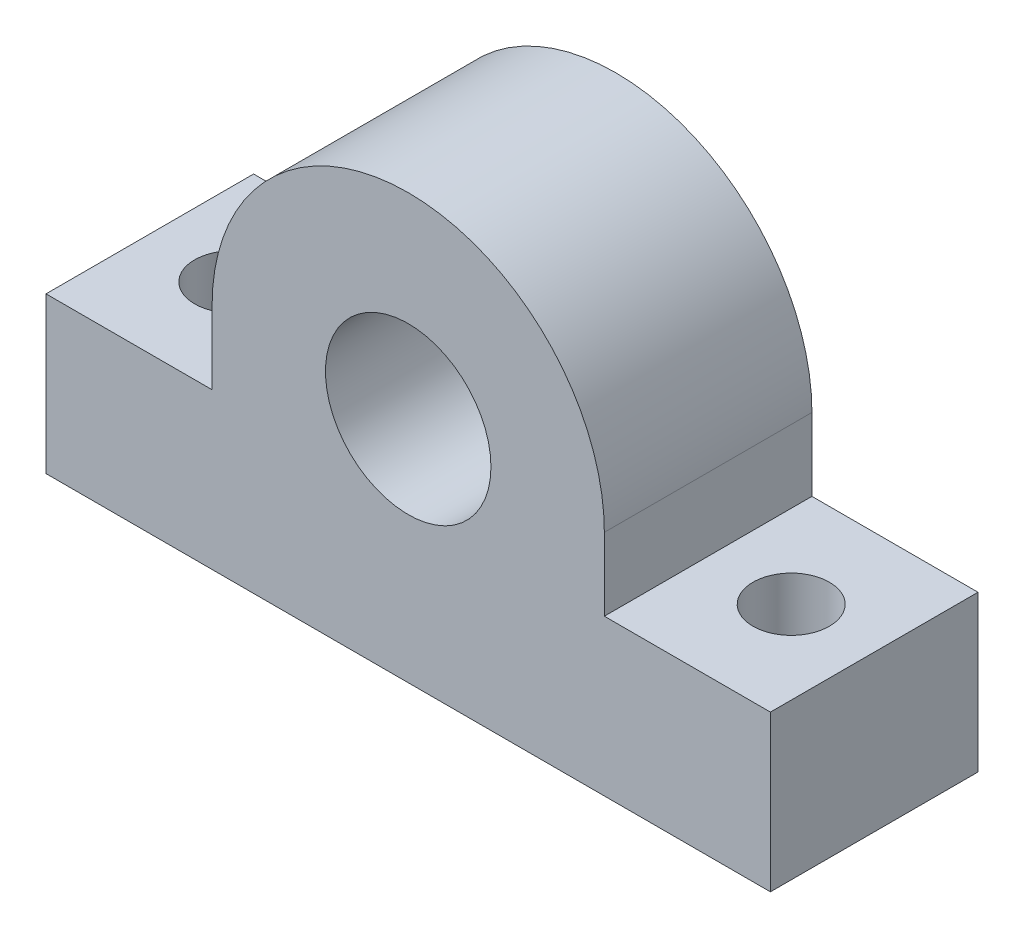
ISO-10303-21;
HEADER;
FILE_DESCRIPTION(('STEP AP214'),'2;1');
FILE_NAME('part.step','',(''),(''),'','','');
FILE_SCHEMA(('AUTOMOTIVE_DESIGN { 1 0 10303 214 1 1 1 1 }'));
ENDSEC;
DATA;
#1=APPLICATION_CONTEXT('core data for automotive mechanical design processes');
#2=APPLICATION_PROTOCOL_DEFINITION('international standard','automotive_design',2000,#1);
#3=PRODUCT_CONTEXT('',#1,'mechanical');
#4=PRODUCT('Part','Part','',(#3));
#5=PRODUCT_RELATED_PRODUCT_CATEGORY('part','',(#4));
#6=PRODUCT_DEFINITION_FORMATION('','',#4);
#7=PRODUCT_DEFINITION_CONTEXT('part definition',#1,'design');
#8=PRODUCT_DEFINITION('design','',#6,#7);
#9=PRODUCT_DEFINITION_SHAPE('','',#8);
#10=(LENGTH_UNIT() NAMED_UNIT(*) SI_UNIT(.MILLI.,.METRE.));
#11=(NAMED_UNIT(*) PLANE_ANGLE_UNIT() SI_UNIT($,.RADIAN.));
#12=(NAMED_UNIT(*) SI_UNIT($,.STERADIAN.) SOLID_ANGLE_UNIT());
#13=UNCERTAINTY_MEASURE_WITH_UNIT(LENGTH_MEASURE(1.E-05),#10,'distance_accuracy_value','');
#14=(GEOMETRIC_REPRESENTATION_CONTEXT(3) GLOBAL_UNCERTAINTY_ASSIGNED_CONTEXT((#13)) GLOBAL_UNIT_ASSIGNED_CONTEXT((#10,
#11,#12)) REPRESENTATION_CONTEXT('',''));
#15=CARTESIAN_POINT('',(0.,0.,0.));
#16=DIRECTION('',(0.,0.,1.));
#17=DIRECTION('',(1.,0.,0.));
#18=AXIS2_PLACEMENT_3D('',#15,#16,#17);
#19=CARTESIAN_POINT('',(0.,0.,6.35));
#20=DIRECTION('',(0.,0.,1.));
#21=DIRECTION('',(1.,0.,0.));
#22=AXIS2_PLACEMENT_3D('',#19,#20,#21);
#23=PLANE('',#22);
#24=DIRECTION('',(-1.,0.,0.));
#25=VECTOR('',#24,1.);
#26=CARTESIAN_POINT('',(-11.08,-2.2225,6.35));
#27=LINE('',#26,#25);
#28=CARTESIAN_POINT('',(-6.,-2.2225,6.35));
#29=VERTEX_POINT('',#28);
#30=CARTESIAN_POINT('',(-11.08,-2.2225,6.35));
#31=VERTEX_POINT('',#30);
#32=EDGE_CURVE('E145',#29,#31,#27,.T.);
#33=ORIENTED_EDGE('',*,*,#32,.T.);
#34=DIRECTION('',(0.,-1.,0.));
#35=VECTOR('',#34,1.);
#36=CARTESIAN_POINT('',(-11.08,-6.985,6.35));
#37=LINE('',#36,#35);
#38=CARTESIAN_POINT('',(-11.08,-6.985,6.35));
#39=VERTEX_POINT('',#38);
#40=EDGE_CURVE('E93',#31,#39,#37,.T.);
#41=ORIENTED_EDGE('',*,*,#40,.T.);
#42=DIRECTION('',(1.,0.,0.));
#43=VECTOR('',#42,1.);
#44=CARTESIAN_POINT('',(-11.08,-6.985,6.35));
#45=LINE('',#44,#43);
#46=CARTESIAN_POINT('',(11.08,-6.985,6.35));
#47=VERTEX_POINT('',#46);
#48=EDGE_CURVE('E161',#39,#47,#45,.T.);
#49=ORIENTED_EDGE('',*,*,#48,.T.);
#50=DIRECTION('',(0.,1.,0.));
#51=VECTOR('',#50,1.);
#52=CARTESIAN_POINT('',(11.08,-6.985,6.35));
#53=LINE('',#52,#51);
#54=CARTESIAN_POINT('',(11.08,-2.2225,6.35));
#55=VERTEX_POINT('',#54);
#56=EDGE_CURVE('E174',#47,#55,#53,.T.);
#57=ORIENTED_EDGE('',*,*,#56,.T.);
#58=DIRECTION('',(-1.,0.,0.));
#59=VECTOR('',#58,1.);
#60=CARTESIAN_POINT('',(11.08,-2.2225,6.35));
#61=LINE('',#60,#59);
#62=CARTESIAN_POINT('',(6.,-2.2225,6.35));
#63=VERTEX_POINT('',#62);
#64=EDGE_CURVE('E112',#55,#63,#61,.T.);
#65=ORIENTED_EDGE('',*,*,#64,.T.);
#66=DIRECTION('',(0.,1.,0.));
#67=VECTOR('',#66,1.);
#68=CARTESIAN_POINT('',(6.,0.,6.35));
#69=LINE('',#68,#67);
#70=CARTESIAN_POINT('',(6.,0.,6.35));
#71=VERTEX_POINT('',#70);
#72=EDGE_CURVE('E106',#63,#71,#69,.T.);
#73=ORIENTED_EDGE('',*,*,#72,.T.);
#74=CARTESIAN_POINT('',(0.,0.,6.35));
#75=DIRECTION('',(0.,0.,1.));
#76=DIRECTION('',(1.,0.,0.));
#77=AXIS2_PLACEMENT_3D('',#74,#75,#76);
#78=CIRCLE('',#77,6.);
#79=CARTESIAN_POINT('',(-6.,0.,6.35));
#80=VERTEX_POINT('',#79);
#81=EDGE_CURVE('E110',#71,#80,#78,.T.);
#82=ORIENTED_EDGE('',*,*,#81,.T.);
#83=DIRECTION('',(0.,-1.,0.));
#84=VECTOR('',#83,1.);
#85=CARTESIAN_POINT('',(-6.,0.,6.35));
#86=LINE('',#85,#84);
#87=EDGE_CURVE('E50',#80,#29,#86,.T.);
#88=ORIENTED_EDGE('',*,*,#87,.T.);
#89=EDGE_LOOP('',(#33,#41,#49,#57,#65,#73,#82,#88));
#90=FACE_BOUND('',#89,.T.);
#91=CARTESIAN_POINT('',(0.,0.,6.35));
#92=DIRECTION('',(0.,0.,1.));
#93=DIRECTION('',(1.,0.,0.));
#94=AXIS2_PLACEMENT_3D('',#91,#92,#93);
#95=CIRCLE('',#94,2.53125);
#96=CARTESIAN_POINT('',(2.53125,0.,6.35));
#97=VERTEX_POINT('',#96);
#98=EDGE_CURVE('E134',#97,#97,#95,.T.);
#99=ORIENTED_EDGE('',*,*,#98,.F.);
#100=EDGE_LOOP('',(#99));
#101=FACE_BOUND('',#100,.T.);
#102=ADVANCED_FACE('F32',(#90,#101),#23,.T.);
#103=CARTESIAN_POINT('',(0.,0.,0.));
#104=DIRECTION('',(0.,0.,1.));
#105=DIRECTION('',(1.,0.,0.));
#106=AXIS2_PLACEMENT_3D('',#103,#104,#105);
#107=PLANE('',#106);
#108=DIRECTION('',(-1.,0.,0.));
#109=VECTOR('',#108,1.);
#110=CARTESIAN_POINT('',(-11.08,-2.2225,0.));
#111=LINE('',#110,#109);
#112=CARTESIAN_POINT('',(-6.,-2.2225,0.));
#113=VERTEX_POINT('',#112);
#114=CARTESIAN_POINT('',(-11.08,-2.2225,0.));
#115=VERTEX_POINT('',#114);
#116=EDGE_CURVE('E130',#113,#115,#111,.T.);
#117=ORIENTED_EDGE('',*,*,#116,.F.);
#118=DIRECTION('',(0.,-1.,0.));
#119=VECTOR('',#118,1.);
#120=CARTESIAN_POINT('',(-6.,0.,0.));
#121=LINE('',#120,#119);
#122=CARTESIAN_POINT('',(-6.,0.,0.));
#123=VERTEX_POINT('',#122);
#124=EDGE_CURVE('E85',#123,#113,#121,.T.);
#125=ORIENTED_EDGE('',*,*,#124,.F.);
#126=CARTESIAN_POINT('',(0.,0.,0.));
#127=DIRECTION('',(0.,0.,1.));
#128=DIRECTION('',(1.,0.,0.));
#129=AXIS2_PLACEMENT_3D('',#126,#127,#128);
#130=CIRCLE('',#129,6.);
#131=CARTESIAN_POINT('',(6.,0.,0.));
#132=VERTEX_POINT('',#131);
#133=EDGE_CURVE('E79',#132,#123,#130,.T.);
#134=ORIENTED_EDGE('',*,*,#133,.F.);
#135=DIRECTION('',(0.,1.,0.));
#136=VECTOR('',#135,1.);
#137=CARTESIAN_POINT('',(6.,0.,0.));
#138=LINE('',#137,#136);
#139=CARTESIAN_POINT('',(6.,-2.2225,0.));
#140=VERTEX_POINT('',#139);
#141=EDGE_CURVE('E120',#140,#132,#138,.T.);
#142=ORIENTED_EDGE('',*,*,#141,.F.);
#143=DIRECTION('',(-1.,0.,0.));
#144=VECTOR('',#143,1.);
#145=CARTESIAN_POINT('',(11.08,-2.2225,0.));
#146=LINE('',#145,#144);
#147=CARTESIAN_POINT('',(11.08,-2.2225,0.));
#148=VERTEX_POINT('',#147);
#149=EDGE_CURVE('E140',#148,#140,#146,.T.);
#150=ORIENTED_EDGE('',*,*,#149,.F.);
#151=DIRECTION('',(0.,1.,0.));
#152=VECTOR('',#151,1.);
#153=CARTESIAN_POINT('',(11.08,-6.985,0.));
#154=LINE('',#153,#152);
#155=CARTESIAN_POINT('',(11.08,-6.985,0.));
#156=VERTEX_POINT('',#155);
#157=EDGE_CURVE('E138',#156,#148,#154,.T.);
#158=ORIENTED_EDGE('',*,*,#157,.F.);
#159=DIRECTION('',(1.,0.,0.));
#160=VECTOR('',#159,1.);
#161=CARTESIAN_POINT('',(-11.08,-6.985,0.));
#162=LINE('',#161,#160);
#163=CARTESIAN_POINT('',(-11.08,-6.985,0.));
#164=VERTEX_POINT('',#163);
#165=EDGE_CURVE('E136',#164,#156,#162,.T.);
#166=ORIENTED_EDGE('',*,*,#165,.F.);
#167=DIRECTION('',(0.,-1.,0.));
#168=VECTOR('',#167,1.);
#169=CARTESIAN_POINT('',(-11.08,-6.985,0.));
#170=LINE('',#169,#168);
#171=EDGE_CURVE('E133',#115,#164,#170,.T.);
#172=ORIENTED_EDGE('',*,*,#171,.F.);
#173=EDGE_LOOP('',(#117,#125,#134,#142,#150,#158,#166,#172));
#174=FACE_BOUND('',#173,.T.);
#175=CARTESIAN_POINT('',(0.,0.,0.));
#176=DIRECTION('',(0.,0.,1.));
#177=DIRECTION('',(1.,0.,0.));
#178=AXIS2_PLACEMENT_3D('',#175,#176,#177);
#179=CIRCLE('',#178,2.53125);
#180=CARTESIAN_POINT('',(2.53125,0.,0.));
#181=VERTEX_POINT('',#180);
#182=EDGE_CURVE('E180',#181,#181,#179,.T.);
#183=ORIENTED_EDGE('',*,*,#182,.T.);
#184=EDGE_LOOP('',(#183));
#185=FACE_BOUND('',#184,.T.);
#186=ADVANCED_FACE('F165',(#174,#185),#107,.F.);
#187=CARTESIAN_POINT('',(-11.08,-2.2225,6.35));
#188=DIRECTION('',(0.,-1.,0.));
#189=DIRECTION('',(0.,0.,-1.));
#190=AXIS2_PLACEMENT_3D('',#187,#188,#189);
#191=PLANE('',#190);
#192=CARTESIAN_POINT('',(-8.54,-2.2225,3.175));
#193=DIRECTION('',(0.,1.,0.));
#194=DIRECTION('',(0.,0.,1.));
#195=AXIS2_PLACEMENT_3D('',#192,#193,#194);
#196=CIRCLE('',#195,1.1684);
#197=CARTESIAN_POINT('',(-8.54,-2.2225,4.3434));
#198=VERTEX_POINT('',#197);
#199=EDGE_CURVE('E185',#198,#198,#196,.T.);
#200=ORIENTED_EDGE('',*,*,#199,.F.);
#201=EDGE_LOOP('',(#200));
#202=FACE_BOUND('',#201,.T.);
#203=ORIENTED_EDGE('',*,*,#116,.T.);
#204=DIRECTION('',(0.,0.,-1.));
#205=VECTOR('',#204,1.);
#206=CARTESIAN_POINT('',(-11.08,-2.2225,6.35));
#207=LINE('',#206,#205);
#208=EDGE_CURVE('E11',#31,#115,#207,.T.);
#209=ORIENTED_EDGE('',*,*,#208,.F.);
#210=ORIENTED_EDGE('',*,*,#32,.F.);
#211=DIRECTION('',(0.,0.,-1.));
#212=VECTOR('',#211,1.);
#213=CARTESIAN_POINT('',(-6.,-2.2225,6.35));
#214=LINE('',#213,#212);
#215=EDGE_CURVE('E126',#29,#113,#214,.T.);
#216=ORIENTED_EDGE('',*,*,#215,.T.);
#217=EDGE_LOOP('',(#203,#209,#210,#216));
#218=FACE_BOUND('',#217,.T.);
#219=ADVANCED_FACE('F34',(#202,#218),#191,.F.);
#220=CARTESIAN_POINT('',(-11.08,-6.985,6.35));
#221=DIRECTION('',(1.,0.,0.));
#222=DIRECTION('',(0.,0.,-1.));
#223=AXIS2_PLACEMENT_3D('',#220,#221,#222);
#224=PLANE('',#223);
#225=ORIENTED_EDGE('',*,*,#171,.T.);
#226=DIRECTION('',(0.,0.,-1.));
#227=VECTOR('',#226,1.);
#228=CARTESIAN_POINT('',(-11.08,-6.985,6.35));
#229=LINE('',#228,#227);
#230=EDGE_CURVE('E42',#39,#164,#229,.T.);
#231=ORIENTED_EDGE('',*,*,#230,.F.);
#232=ORIENTED_EDGE('',*,*,#40,.F.);
#233=ORIENTED_EDGE('',*,*,#208,.T.);
#234=EDGE_LOOP('',(#225,#231,#232,#233));
#235=FACE_BOUND('',#234,.T.);
#236=ADVANCED_FACE('F280',(#235),#224,.F.);
#237=CARTESIAN_POINT('',(-11.08,-6.985,6.35));
#238=DIRECTION('',(0.,1.,0.));
#239=DIRECTION('',(-1.,0.,0.));
#240=AXIS2_PLACEMENT_3D('',#237,#238,#239);
#241=PLANE('',#240);
#242=CARTESIAN_POINT('',(8.54,-6.985,3.175));
#243=DIRECTION('',(0.,1.,0.));
#244=DIRECTION('',(-1.,0.,0.));
#245=AXIS2_PLACEMENT_3D('',#242,#243,#244);
#246=CIRCLE('',#245,1.1684);
#247=CARTESIAN_POINT('',(7.3716,-6.985,3.175));
#248=VERTEX_POINT('',#247);
#249=EDGE_CURVE('E188',#248,#248,#246,.T.);
#250=ORIENTED_EDGE('',*,*,#249,.T.);
#251=EDGE_LOOP('',(#250));
#252=FACE_BOUND('',#251,.T.);
#253=CARTESIAN_POINT('',(-8.54,-6.985,3.175));
#254=DIRECTION('',(0.,1.,0.));
#255=DIRECTION('',(-1.,0.,0.));
#256=AXIS2_PLACEMENT_3D('',#253,#254,#255);
#257=CIRCLE('',#256,1.1684);
#258=CARTESIAN_POINT('',(-9.7084,-6.985,3.175));
#259=VERTEX_POINT('',#258);
#260=EDGE_CURVE('E36',#259,#259,#257,.T.);
#261=ORIENTED_EDGE('',*,*,#260,.T.);
#262=EDGE_LOOP('',(#261));
#263=FACE_BOUND('',#262,.T.);
#264=ORIENTED_EDGE('',*,*,#165,.T.);
#265=DIRECTION('',(0.,0.,-1.));
#266=VECTOR('',#265,1.);
#267=CARTESIAN_POINT('',(11.08,-6.985,6.35));
#268=LINE('',#267,#266);
#269=EDGE_CURVE('E152',#47,#156,#268,.T.);
#270=ORIENTED_EDGE('',*,*,#269,.F.);
#271=ORIENTED_EDGE('',*,*,#48,.F.);
#272=ORIENTED_EDGE('',*,*,#230,.T.);
#273=EDGE_LOOP('',(#264,#270,#271,#272));
#274=FACE_BOUND('',#273,.T.);
#275=ADVANCED_FACE('F159',(#252,#263,#274),#241,.F.);
#276=CARTESIAN_POINT('',(11.08,-6.985,6.35));
#277=DIRECTION('',(-1.,0.,0.));
#278=DIRECTION('',(0.,0.,1.));
#279=AXIS2_PLACEMENT_3D('',#276,#277,#278);
#280=PLANE('',#279);
#281=ORIENTED_EDGE('',*,*,#157,.T.);
#282=DIRECTION('',(0.,0.,-1.));
#283=VECTOR('',#282,1.);
#284=CARTESIAN_POINT('',(11.08,-2.2225,6.35));
#285=LINE('',#284,#283);
#286=EDGE_CURVE('E149',#55,#148,#285,.T.);
#287=ORIENTED_EDGE('',*,*,#286,.F.);
#288=ORIENTED_EDGE('',*,*,#56,.F.);
#289=ORIENTED_EDGE('',*,*,#269,.T.);
#290=EDGE_LOOP('',(#281,#287,#288,#289));
#291=FACE_BOUND('',#290,.T.);
#292=ADVANCED_FACE('F170',(#291),#280,.F.);
#293=CARTESIAN_POINT('',(11.08,-2.2225,6.35));
#294=DIRECTION('',(0.,-1.,0.));
#295=DIRECTION('',(0.,0.,-1.));
#296=AXIS2_PLACEMENT_3D('',#293,#294,#295);
#297=PLANE('',#296);
#298=CARTESIAN_POINT('',(8.54,-2.2225,3.175));
#299=DIRECTION('',(0.,1.,0.));
#300=DIRECTION('',(0.,0.,1.));
#301=AXIS2_PLACEMENT_3D('',#298,#299,#300);
#302=CIRCLE('',#301,1.1684);
#303=CARTESIAN_POINT('',(8.54,-2.2225,4.3434));
#304=VERTEX_POINT('',#303);
#305=EDGE_CURVE('E191',#304,#304,#302,.T.);
#306=ORIENTED_EDGE('',*,*,#305,.F.);
#307=EDGE_LOOP('',(#306));
#308=FACE_BOUND('',#307,.T.);
#309=ORIENTED_EDGE('',*,*,#149,.T.);
#310=DIRECTION('',(0.,0.,-1.));
#311=VECTOR('',#310,1.);
#312=CARTESIAN_POINT('',(6.,-2.2225,6.35));
#313=LINE('',#312,#311);
#314=EDGE_CURVE('E121',#63,#140,#313,.T.);
#315=ORIENTED_EDGE('',*,*,#314,.F.);
#316=ORIENTED_EDGE('',*,*,#64,.F.);
#317=ORIENTED_EDGE('',*,*,#286,.T.);
#318=EDGE_LOOP('',(#309,#315,#316,#317));
#319=FACE_BOUND('',#318,.T.);
#320=ADVANCED_FACE('F173',(#308,#319),#297,.F.);
#321=CARTESIAN_POINT('',(6.,0.,6.35));
#322=DIRECTION('',(-1.,0.,0.));
#323=DIRECTION('',(0.,0.,1.));
#324=AXIS2_PLACEMENT_3D('',#321,#322,#323);
#325=PLANE('',#324);
#326=ORIENTED_EDGE('',*,*,#141,.T.);
#327=DIRECTION('',(0.,0.,-1.));
#328=VECTOR('',#327,1.);
#329=CARTESIAN_POINT('',(6.,0.,6.35));
#330=LINE('',#329,#328);
#331=EDGE_CURVE('E117',#71,#132,#330,.T.);
#332=ORIENTED_EDGE('',*,*,#331,.F.);
#333=ORIENTED_EDGE('',*,*,#72,.F.);
#334=ORIENTED_EDGE('',*,*,#314,.T.);
#335=EDGE_LOOP('',(#326,#332,#333,#334));
#336=FACE_BOUND('',#335,.T.);
#337=ADVANCED_FACE('F118',(#336),#325,.F.);
#338=CARTESIAN_POINT('',(0.,0.,6.35));
#339=DIRECTION('',(0.,0.,-1.));
#340=DIRECTION('',(-1.,0.,0.));
#341=AXIS2_PLACEMENT_3D('',#338,#339,#340);
#342=CYLINDRICAL_SURFACE('',#341,6.);
#343=ORIENTED_EDGE('',*,*,#133,.T.);
#344=DIRECTION('',(0.,0.,-1.));
#345=VECTOR('',#344,1.);
#346=CARTESIAN_POINT('',(-6.,0.,6.35));
#347=LINE('',#346,#345);
#348=EDGE_CURVE('E122',#80,#123,#347,.T.);
#349=ORIENTED_EDGE('',*,*,#348,.F.);
#350=ORIENTED_EDGE('',*,*,#81,.F.);
#351=ORIENTED_EDGE('',*,*,#331,.T.);
#352=EDGE_LOOP('',(#343,#349,#350,#351));
#353=FACE_BOUND('',#352,.T.);
#354=ADVANCED_FACE('F124',(#353),#342,.T.);
#355=CARTESIAN_POINT('',(-6.,0.,6.35));
#356=DIRECTION('',(1.,0.,0.));
#357=DIRECTION('',(0.,0.,-1.));
#358=AXIS2_PLACEMENT_3D('',#355,#356,#357);
#359=PLANE('',#358);
#360=ORIENTED_EDGE('',*,*,#124,.T.);
#361=ORIENTED_EDGE('',*,*,#215,.F.);
#362=ORIENTED_EDGE('',*,*,#87,.F.);
#363=ORIENTED_EDGE('',*,*,#348,.T.);
#364=EDGE_LOOP('',(#360,#361,#362,#363));
#365=FACE_BOUND('',#364,.T.);
#366=ADVANCED_FACE('F218',(#365),#359,.F.);
#367=CARTESIAN_POINT('',(0.,0.,6.35));
#368=DIRECTION('',(0.,0.,-1.));
#369=DIRECTION('',(-1.,0.,0.));
#370=AXIS2_PLACEMENT_3D('',#367,#368,#369);
#371=CYLINDRICAL_SURFACE('',#370,2.53125);
#372=ORIENTED_EDGE('',*,*,#98,.T.);
#373=EDGE_LOOP('',(#372));
#374=FACE_BOUND('',#373,.T.);
#375=ORIENTED_EDGE('',*,*,#182,.F.);
#376=EDGE_LOOP('',(#375));
#377=FACE_BOUND('',#376,.T.);
#378=ADVANCED_FACE('F215',(#374,#377),#371,.F.);
#379=CARTESIAN_POINT('',(-8.54,-8.5725,3.175));
#380=DIRECTION('',(0.,1.,0.));
#381=DIRECTION('',(0.,0.,1.));
#382=AXIS2_PLACEMENT_3D('',#379,#380,#381);
#383=CYLINDRICAL_SURFACE('',#382,1.1684);
#384=ORIENTED_EDGE('',*,*,#199,.T.);
#385=EDGE_LOOP('',(#384));
#386=FACE_BOUND('',#385,.T.);
#387=ORIENTED_EDGE('',*,*,#260,.F.);
#388=EDGE_LOOP('',(#387));
#389=FACE_BOUND('',#388,.T.);
#390=ADVANCED_FACE('F236',(#386,#389),#383,.F.);
#391=CARTESIAN_POINT('',(8.54,-8.5725,3.175));
#392=DIRECTION('',(0.,1.,0.));
#393=DIRECTION('',(0.,0.,1.));
#394=AXIS2_PLACEMENT_3D('',#391,#392,#393);
#395=CYLINDRICAL_SURFACE('',#394,1.1684);
#396=ORIENTED_EDGE('',*,*,#305,.T.);
#397=EDGE_LOOP('',(#396));
#398=FACE_BOUND('',#397,.T.);
#399=ORIENTED_EDGE('',*,*,#249,.F.);
#400=EDGE_LOOP('',(#399));
#401=FACE_BOUND('',#400,.T.);
#402=ADVANCED_FACE('F195',(#398,#401),#395,.F.);
#403=CLOSED_SHELL('',(#102,#186,#219,#236,#275,#292,#320,#337,#354,#366,#378,#390,#402));
#404=MANIFOLD_SOLID_BREP('B2',#403);
#405=ADVANCED_BREP_SHAPE_REPRESENTATION('',(#18,#404),#14);
#406=SHAPE_DEFINITION_REPRESENTATION(#9,#405);
ENDSEC;
END-ISO-10303-21;
